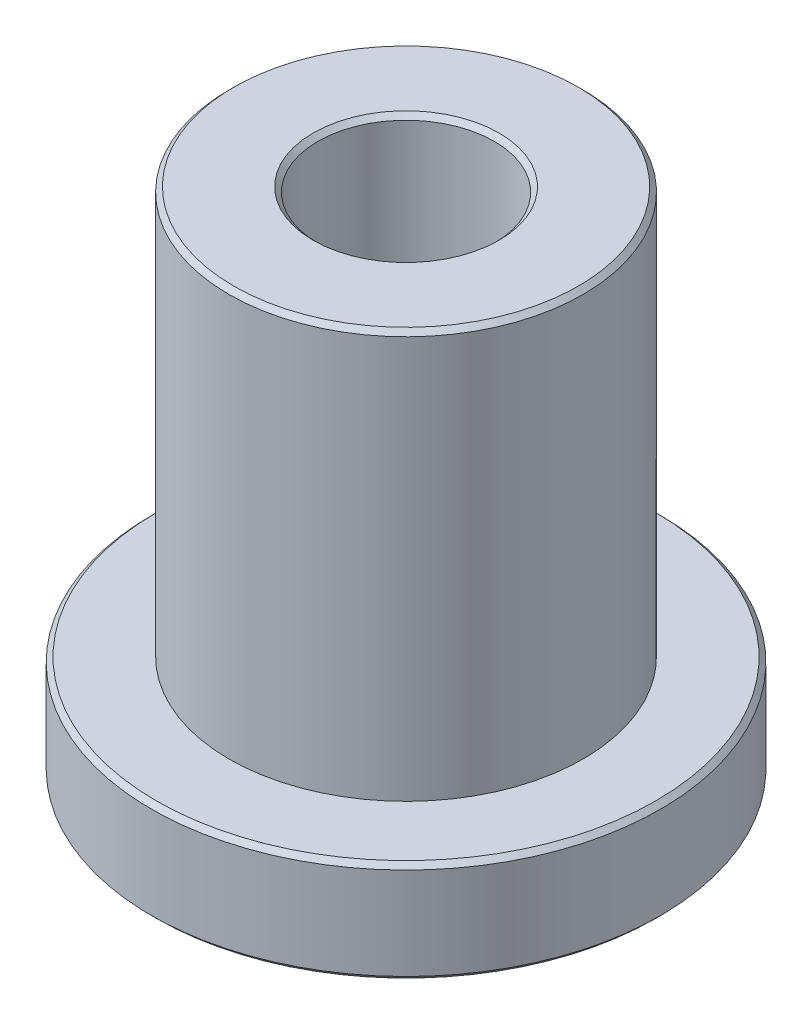
ISO-10303-21;
HEADER;
FILE_DESCRIPTION(('STEP AP214'),'2;1');
FILE_NAME('part.step','',(''),(''),'','','');
FILE_SCHEMA(('AUTOMOTIVE_DESIGN { 1 0 10303 214 1 1 1 1 }'));
ENDSEC;
DATA;
#1=APPLICATION_CONTEXT('core data for automotive mechanical design processes');
#2=APPLICATION_PROTOCOL_DEFINITION('international standard','automotive_design',2000,#1);
#3=PRODUCT_CONTEXT('',#1,'mechanical');
#4=PRODUCT('Part','Part','',(#3));
#5=PRODUCT_RELATED_PRODUCT_CATEGORY('part','',(#4));
#6=PRODUCT_DEFINITION_FORMATION('','',#4);
#7=PRODUCT_DEFINITION_CONTEXT('part definition',#1,'design');
#8=PRODUCT_DEFINITION('design','',#6,#7);
#9=PRODUCT_DEFINITION_SHAPE('','',#8);
#10=(LENGTH_UNIT() NAMED_UNIT(*) SI_UNIT(.MILLI.,.METRE.));
#11=(NAMED_UNIT(*) PLANE_ANGLE_UNIT() SI_UNIT($,.RADIAN.));
#12=(NAMED_UNIT(*) SI_UNIT($,.STERADIAN.) SOLID_ANGLE_UNIT());
#13=UNCERTAINTY_MEASURE_WITH_UNIT(LENGTH_MEASURE(1.E-05),#10,'distance_accuracy_value','');
#14=(GEOMETRIC_REPRESENTATION_CONTEXT(3) GLOBAL_UNCERTAINTY_ASSIGNED_CONTEXT((#13)) GLOBAL_UNIT_ASSIGNED_CONTEXT((#10,
#11,#12)) REPRESENTATION_CONTEXT('',''));
#15=CARTESIAN_POINT('',(0.,0.,0.));
#16=DIRECTION('',(0.,0.,1.));
#17=DIRECTION('',(1.,0.,0.));
#18=AXIS2_PLACEMENT_3D('',#15,#16,#17);
#19=CARTESIAN_POINT('',(0.,25.4,0.));
#20=DIRECTION('',(0.,-1.,0.));
#21=DIRECTION('',(0.,0.,-1.));
#22=AXIS2_PLACEMENT_3D('',#19,#20,#21);
#23=CYLINDRICAL_SURFACE('',#22,11.049);
#24=CARTESIAN_POINT('',(0.,25.100000092,0.));
#25=DIRECTION('',(0.,1.,0.));
#26=DIRECTION('',(0.,0.,1.));
#27=AXIS2_PLACEMENT_3D('',#24,#25,#26);
#28=CIRCLE('',#27,11.049);
#29=CARTESIAN_POINT('',(0.,25.100000092,11.049));
#30=VERTEX_POINT('',#29);
#31=EDGE_CURVE('E10',#30,#30,#28,.F.);
#32=ORIENTED_EDGE('',*,*,#31,.T.);
#33=EDGE_LOOP('',(#32));
#34=FACE_BOUND('',#33,.T.);
#35=CARTESIAN_POINT('',(0.,0.,0.));
#36=DIRECTION('',(0.,1.,0.));
#37=DIRECTION('',(0.,0.,1.));
#38=AXIS2_PLACEMENT_3D('',#35,#36,#37);
#39=CIRCLE('',#38,11.049);
#40=CARTESIAN_POINT('',(0.,0.,11.049));
#41=VERTEX_POINT('',#40);
#42=EDGE_CURVE('E76',#41,#41,#39,.T.);
#43=ORIENTED_EDGE('',*,*,#42,.T.);
#44=EDGE_LOOP('',(#43));
#45=FACE_BOUND('',#44,.T.);
#46=ADVANCED_FACE('F37',(#34,#45),#23,.T.);
#47=CARTESIAN_POINT('',(0.,25.4,0.));
#48=DIRECTION('',(0.,1.,0.));
#49=DIRECTION('',(0.,0.,1.));
#50=AXIS2_PLACEMENT_3D('',#47,#48,#49);
#51=PLANE('',#50);
#52=CARTESIAN_POINT('',(0.,25.4,0.));
#53=DIRECTION('',(0.,1.,0.));
#54=DIRECTION('',(0.,0.,1.));
#55=AXIS2_PLACEMENT_3D('',#52,#53,#54);
#56=CIRCLE('',#55,10.749000092);
#57=CARTESIAN_POINT('',(0.,25.4,10.749000092));
#58=VERTEX_POINT('',#57);
#59=EDGE_CURVE('E45',#58,#58,#56,.T.);
#60=ORIENTED_EDGE('',*,*,#59,.T.);
#61=EDGE_LOOP('',(#60));
#62=FACE_BOUND('',#61,.T.);
#63=CARTESIAN_POINT('',(0.,25.4,0.));
#64=DIRECTION('',(0.,1.,0.));
#65=DIRECTION('',(0.,0.,1.));
#66=AXIS2_PLACEMENT_3D('',#63,#64,#65);
#67=CIRCLE('',#66,5.79999990799999);
#68=CARTESIAN_POINT('',(0.,25.4,5.79999990799999));
#69=VERTEX_POINT('',#68);
#70=EDGE_CURVE('E49',#69,#69,#67,.F.);
#71=ORIENTED_EDGE('',*,*,#70,.T.);
#72=EDGE_LOOP('',(#71));
#73=FACE_BOUND('',#72,.T.);
#74=ADVANCED_FACE('F99',(#62,#73),#51,.T.);
#75=CARTESIAN_POINT('',(0.,-6.35,0.));
#76=DIRECTION('',(0.,1.,0.));
#77=DIRECTION('',(0.,0.,1.));
#78=AXIS2_PLACEMENT_3D('',#75,#76,#77);
#79=CYLINDRICAL_SURFACE('',#78,15.875);
#80=CARTESIAN_POINT('',(0.,-0.299999908,0.));
#81=DIRECTION('',(0.,-1.,0.));
#82=DIRECTION('',(0.,0.,-1.));
#83=AXIS2_PLACEMENT_3D('',#80,#81,#82);
#84=CIRCLE('',#83,15.875);
#85=CARTESIAN_POINT('',(0.,-0.299999908,-15.875));
#86=VERTEX_POINT('',#85);
#87=EDGE_CURVE('E70',#86,#86,#84,.T.);
#88=ORIENTED_EDGE('',*,*,#87,.T.);
#89=EDGE_LOOP('',(#88));
#90=FACE_BOUND('',#89,.T.);
#91=CARTESIAN_POINT('',(0.,-6.05000009199999,0.));
#92=DIRECTION('',(0.,-1.,0.));
#93=DIRECTION('',(0.,0.,-1.));
#94=AXIS2_PLACEMENT_3D('',#91,#92,#93);
#95=CIRCLE('',#94,15.875);
#96=CARTESIAN_POINT('',(0.,-6.05000009199999,-15.875));
#97=VERTEX_POINT('',#96);
#98=EDGE_CURVE('E73',#97,#97,#95,.F.);
#99=ORIENTED_EDGE('',*,*,#98,.T.);
#100=EDGE_LOOP('',(#99));
#101=FACE_BOUND('',#100,.T.);
#102=ADVANCED_FACE('F94',(#90,#101),#79,.T.);
#103=CARTESIAN_POINT('',(0.,-6.35,0.));
#104=DIRECTION('',(0.,-1.,0.));
#105=DIRECTION('',(0.,0.,-1.));
#106=AXIS2_PLACEMENT_3D('',#103,#104,#105);
#107=PLANE('',#106);
#108=CARTESIAN_POINT('',(0.,-6.35,0.));
#109=DIRECTION('',(0.,-1.,0.));
#110=DIRECTION('',(0.,0.,-1.));
#111=AXIS2_PLACEMENT_3D('',#108,#109,#110);
#112=CIRCLE('',#111,15.575000092);
#113=CARTESIAN_POINT('',(0.,-6.35,-15.575000092));
#114=VERTEX_POINT('',#113);
#115=EDGE_CURVE('E61',#114,#114,#112,.T.);
#116=ORIENTED_EDGE('',*,*,#115,.T.);
#117=EDGE_LOOP('',(#116));
#118=FACE_BOUND('',#117,.T.);
#119=CARTESIAN_POINT('',(0.,-6.35,0.));
#120=DIRECTION('',(0.,-1.,0.));
#121=DIRECTION('',(0.,0.,-1.));
#122=AXIS2_PLACEMENT_3D('',#119,#120,#121);
#123=CIRCLE('',#122,5.79999990799999);
#124=CARTESIAN_POINT('',(0.,-6.35,-5.79999990799999));
#125=VERTEX_POINT('',#124);
#126=EDGE_CURVE('E64',#125,#125,#123,.F.);
#127=ORIENTED_EDGE('',*,*,#126,.T.);
#128=EDGE_LOOP('',(#127));
#129=FACE_BOUND('',#128,.T.);
#130=ADVANCED_FACE('F84',(#118,#129),#107,.T.);
#131=CARTESIAN_POINT('',(0.,0.,0.));
#132=DIRECTION('',(0.,-1.,0.));
#133=DIRECTION('',(0.,0.,-1.));
#134=AXIS2_PLACEMENT_3D('',#131,#132,#133);
#135=PLANE('',#134);
#136=CARTESIAN_POINT('',(0.,0.,0.));
#137=DIRECTION('',(0.,-1.,0.));
#138=DIRECTION('',(0.,0.,-1.));
#139=AXIS2_PLACEMENT_3D('',#136,#137,#138);
#140=CIRCLE('',#139,15.575000092);
#141=CARTESIAN_POINT('',(0.,0.,-15.575000092));
#142=VERTEX_POINT('',#141);
#143=EDGE_CURVE('E67',#142,#142,#140,.F.);
#144=ORIENTED_EDGE('',*,*,#143,.T.);
#145=EDGE_LOOP('',(#144));
#146=FACE_BOUND('',#145,.T.);
#147=ORIENTED_EDGE('',*,*,#42,.F.);
#148=EDGE_LOOP('',(#147));
#149=FACE_BOUND('',#148,.T.);
#150=ADVANCED_FACE('F81',(#146,#149),#135,.F.);
#151=CARTESIAN_POINT('',(0.,25.4,0.));
#152=DIRECTION('',(0.,-1.,0.));
#153=DIRECTION('',(0.,0.,-1.));
#154=AXIS2_PLACEMENT_3D('',#151,#152,#153);
#155=CYLINDRICAL_SURFACE('',#154,5.5);
#156=CARTESIAN_POINT('',(0.,-6.050000092,0.));
#157=DIRECTION('',(0.,-1.,0.));
#158=DIRECTION('',(0.,0.,-1.));
#159=AXIS2_PLACEMENT_3D('',#156,#157,#158);
#160=CIRCLE('',#159,5.5);
#161=CARTESIAN_POINT('',(0.,-6.050000092,-5.5));
#162=VERTEX_POINT('',#161);
#163=EDGE_CURVE('E53',#162,#162,#160,.T.);
#164=ORIENTED_EDGE('',*,*,#163,.T.);
#165=EDGE_LOOP('',(#164));
#166=FACE_BOUND('',#165,.T.);
#167=CARTESIAN_POINT('',(0.,25.100000092,0.));
#168=DIRECTION('',(0.,1.,0.));
#169=DIRECTION('',(0.,0.,1.));
#170=AXIS2_PLACEMENT_3D('',#167,#168,#169);
#171=CIRCLE('',#170,5.5);
#172=CARTESIAN_POINT('',(0.,25.100000092,5.5));
#173=VERTEX_POINT('',#172);
#174=EDGE_CURVE('E58',#173,#173,#171,.T.);
#175=ORIENTED_EDGE('',*,*,#174,.T.);
#176=EDGE_LOOP('',(#175));
#177=FACE_BOUND('',#176,.T.);
#178=ADVANCED_FACE('F83',(#166,#177),#155,.F.);
#179=CARTESIAN_POINT('',(0.,-0.299999908,0.));
#180=DIRECTION('',(0.,-1.,0.));
#181=DIRECTION('',(0.,0.,-1.));
#182=AXIS2_PLACEMENT_3D('',#179,#180,#181);
#183=CONICAL_SURFACE('',#182,15.875,0.785398163397454);
#184=ORIENTED_EDGE('',*,*,#143,.F.);
#185=EDGE_LOOP('',(#184));
#186=FACE_BOUND('',#185,.T.);
#187=ORIENTED_EDGE('',*,*,#87,.F.);
#188=EDGE_LOOP('',(#187));
#189=FACE_BOUND('',#188,.T.);
#190=ADVANCED_FACE('F91',(#186,#189),#183,.T.);
#191=CARTESIAN_POINT('',(0.,-6.35,0.));
#192=DIRECTION('',(0.,1.,0.));
#193=DIRECTION('',(0.,0.,1.));
#194=AXIS2_PLACEMENT_3D('',#191,#192,#193);
#195=CONICAL_SURFACE('',#194,15.575000092,0.785398163397448);
#196=ORIENTED_EDGE('',*,*,#98,.F.);
#197=EDGE_LOOP('',(#196));
#198=FACE_BOUND('',#197,.T.);
#199=ORIENTED_EDGE('',*,*,#115,.F.);
#200=EDGE_LOOP('',(#199));
#201=FACE_BOUND('',#200,.T.);
#202=ADVANCED_FACE('F112',(#198,#201),#195,.T.);
#203=CARTESIAN_POINT('',(0.,-6.050000092,0.));
#204=DIRECTION('',(0.,-1.,0.));
#205=DIRECTION('',(0.,0.,-1.));
#206=AXIS2_PLACEMENT_3D('',#203,#204,#205);
#207=CONICAL_SURFACE('',#206,5.5,0.785398163397434);
#208=ORIENTED_EDGE('',*,*,#126,.F.);
#209=EDGE_LOOP('',(#208));
#210=FACE_BOUND('',#209,.T.);
#211=ORIENTED_EDGE('',*,*,#163,.F.);
#212=EDGE_LOOP('',(#211));
#213=FACE_BOUND('',#212,.T.);
#214=ADVANCED_FACE('F119',(#210,#213),#207,.F.);
#215=CARTESIAN_POINT('',(0.,25.4,0.));
#216=DIRECTION('',(0.,-1.,0.));
#217=DIRECTION('',(0.,0.,-1.));
#218=AXIS2_PLACEMENT_3D('',#215,#216,#217);
#219=CONICAL_SURFACE('',#218,10.749000092,0.785398163397443);
#220=ORIENTED_EDGE('',*,*,#31,.F.);
#221=EDGE_LOOP('',(#220));
#222=FACE_BOUND('',#221,.T.);
#223=ORIENTED_EDGE('',*,*,#59,.F.);
#224=EDGE_LOOP('',(#223));
#225=FACE_BOUND('',#224,.T.);
#226=ADVANCED_FACE('F125',(#222,#225),#219,.T.);
#227=CARTESIAN_POINT('',(0.,25.4,0.));
#228=DIRECTION('',(0.,1.,0.));
#229=DIRECTION('',(0.,0.,1.));
#230=AXIS2_PLACEMENT_3D('',#227,#228,#229);
#231=CONICAL_SURFACE('',#230,5.79999990799999,0.785398163397434);
#232=ORIENTED_EDGE('',*,*,#174,.F.);
#233=EDGE_LOOP('',(#232));
#234=FACE_BOUND('',#233,.T.);
#235=ORIENTED_EDGE('',*,*,#70,.F.);
#236=EDGE_LOOP('',(#235));
#237=FACE_BOUND('',#236,.T.);
#238=ADVANCED_FACE('F40',(#234,#237),#231,.F.);
#239=CLOSED_SHELL('',(#46,#74,#102,#130,#150,#178,#190,#202,#214,#226,#238));
#240=MANIFOLD_SOLID_BREP('B2',#239);
#241=ADVANCED_BREP_SHAPE_REPRESENTATION('',(#18,#240),#14);
#242=SHAPE_DEFINITION_REPRESENTATION(#9,#241);
ENDSEC;
END-ISO-10303-21;
